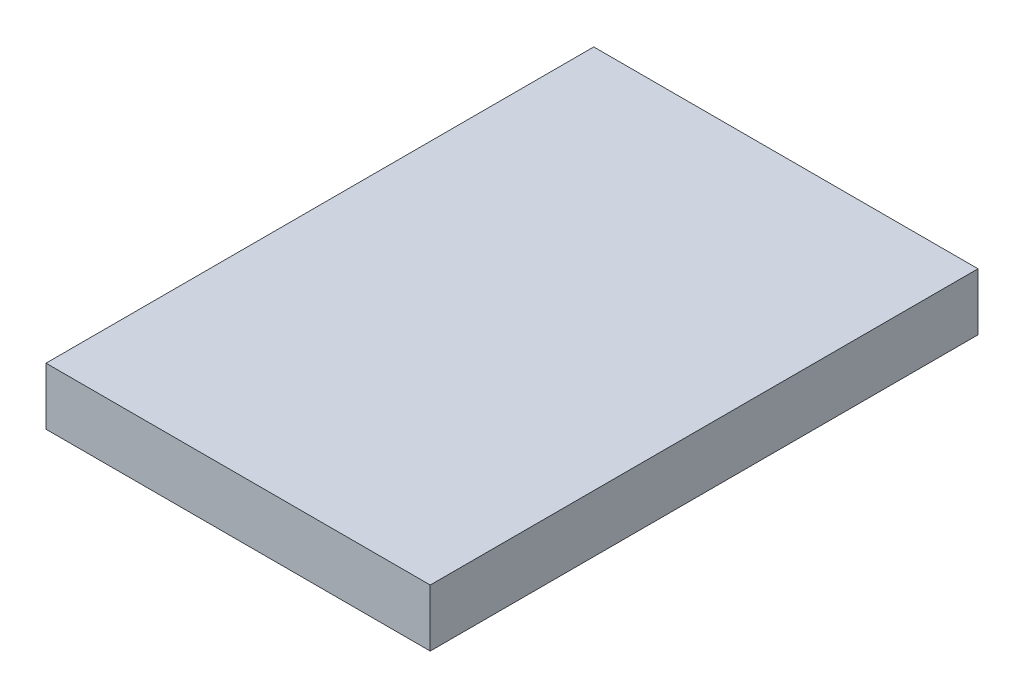
ISO-10303-21;
HEADER;
FILE_DESCRIPTION(('STEP AP214'),'2;1');
FILE_NAME('part.step','',(''),(''),'','','');
FILE_SCHEMA(('AUTOMOTIVE_DESIGN { 1 0 10303 214 1 1 1 1 }'));
ENDSEC;
DATA;
#1=APPLICATION_CONTEXT('core data for automotive mechanical design processes');
#2=APPLICATION_PROTOCOL_DEFINITION('international standard','automotive_design',2000,#1);
#3=PRODUCT_CONTEXT('',#1,'mechanical');
#4=PRODUCT('Part','Part','',(#3));
#5=PRODUCT_RELATED_PRODUCT_CATEGORY('part','',(#4));
#6=PRODUCT_DEFINITION_FORMATION('','',#4);
#7=PRODUCT_DEFINITION_CONTEXT('part definition',#1,'design');
#8=PRODUCT_DEFINITION('design','',#6,#7);
#9=PRODUCT_DEFINITION_SHAPE('','',#8);
#10=(LENGTH_UNIT() NAMED_UNIT(*) SI_UNIT(.MILLI.,.METRE.));
#11=(NAMED_UNIT(*) PLANE_ANGLE_UNIT() SI_UNIT($,.RADIAN.));
#12=(NAMED_UNIT(*) SI_UNIT($,.STERADIAN.) SOLID_ANGLE_UNIT());
#13=UNCERTAINTY_MEASURE_WITH_UNIT(LENGTH_MEASURE(1.E-05),#10,'distance_accuracy_value','');
#14=(GEOMETRIC_REPRESENTATION_CONTEXT(3) GLOBAL_UNCERTAINTY_ASSIGNED_CONTEXT((#13)) GLOBAL_UNIT_ASSIGNED_CONTEXT((#10,
#11,#12)) REPRESENTATION_CONTEXT('',''));
#15=CARTESIAN_POINT('',(0.,0.,0.));
#16=DIRECTION('',(0.,0.,1.));
#17=DIRECTION('',(1.,0.,0.));
#18=AXIS2_PLACEMENT_3D('',#15,#16,#17);
#19=CARTESIAN_POINT('',(0.,11.1125,0.));
#20=DIRECTION('',(1.,0.,0.));
#21=DIRECTION('',(0.,0.,-1.));
#22=AXIS2_PLACEMENT_3D('',#19,#20,#21);
#23=PLANE('',#22);
#24=DIRECTION('',(0.,0.,1.));
#25=VECTOR('',#24,1.);
#26=CARTESIAN_POINT('',(0.,0.,0.));
#27=LINE('',#26,#25);
#28=CARTESIAN_POINT('',(0.,0.,-106.3625));
#29=VERTEX_POINT('',#28);
#30=CARTESIAN_POINT('',(0.,0.,0.));
#31=VERTEX_POINT('',#30);
#32=EDGE_CURVE('E105',#29,#31,#27,.T.);
#33=ORIENTED_EDGE('',*,*,#32,.T.);
#34=DIRECTION('',(0.,-1.,0.));
#35=VECTOR('',#34,1.);
#36=CARTESIAN_POINT('',(0.,11.1125,0.));
#37=LINE('',#36,#35);
#38=CARTESIAN_POINT('',(0.,11.1125,0.));
#39=VERTEX_POINT('',#38);
#40=EDGE_CURVE('E11',#39,#31,#37,.T.);
#41=ORIENTED_EDGE('',*,*,#40,.F.);
#42=DIRECTION('',(0.,0.,1.));
#43=VECTOR('',#42,1.);
#44=CARTESIAN_POINT('',(0.,11.1125,0.));
#45=LINE('',#44,#43);
#46=CARTESIAN_POINT('',(0.,11.1125,-106.3625));
#47=VERTEX_POINT('',#46);
#48=EDGE_CURVE('E89',#47,#39,#45,.T.);
#49=ORIENTED_EDGE('',*,*,#48,.F.);
#50=DIRECTION('',(0.,-1.,0.));
#51=VECTOR('',#50,1.);
#52=CARTESIAN_POINT('',(0.,11.1125,-106.3625));
#53=LINE('',#52,#51);
#54=EDGE_CURVE('E97',#47,#29,#53,.T.);
#55=ORIENTED_EDGE('',*,*,#54,.T.);
#56=EDGE_LOOP('',(#33,#41,#49,#55));
#57=FACE_BOUND('',#56,.T.);
#58=ADVANCED_FACE('F39',(#57),#23,.F.);
#59=CARTESIAN_POINT('',(0.,11.1125,0.));
#60=DIRECTION('',(0.,0.,-1.));
#61=DIRECTION('',(-1.,0.,0.));
#62=AXIS2_PLACEMENT_3D('',#59,#60,#61);
#63=PLANE('',#62);
#64=DIRECTION('',(1.,0.,0.));
#65=VECTOR('',#64,1.);
#66=CARTESIAN_POINT('',(0.,0.,0.));
#67=LINE('',#66,#65);
#68=CARTESIAN_POINT('',(74.6125,0.,0.));
#69=VERTEX_POINT('',#68);
#70=EDGE_CURVE('E92',#31,#69,#67,.T.);
#71=ORIENTED_EDGE('',*,*,#70,.T.);
#72=DIRECTION('',(0.,-1.,0.));
#73=VECTOR('',#72,1.);
#74=CARTESIAN_POINT('',(74.6125,11.1125,0.));
#75=LINE('',#74,#73);
#76=CARTESIAN_POINT('',(74.6125,11.1125,0.));
#77=VERTEX_POINT('',#76);
#78=EDGE_CURVE('E50',#77,#69,#75,.T.);
#79=ORIENTED_EDGE('',*,*,#78,.F.);
#80=DIRECTION('',(1.,0.,0.));
#81=VECTOR('',#80,1.);
#82=CARTESIAN_POINT('',(0.,11.1125,0.));
#83=LINE('',#82,#81);
#84=EDGE_CURVE('E82',#39,#77,#83,.T.);
#85=ORIENTED_EDGE('',*,*,#84,.F.);
#86=ORIENTED_EDGE('',*,*,#40,.T.);
#87=EDGE_LOOP('',(#71,#79,#85,#86));
#88=FACE_BOUND('',#87,.T.);
#89=ADVANCED_FACE('F93',(#88),#63,.F.);
#90=CARTESIAN_POINT('',(74.6125,11.1125,0.));
#91=DIRECTION('',(-1.,0.,0.));
#92=DIRECTION('',(0.,0.,1.));
#93=AXIS2_PLACEMENT_3D('',#90,#91,#92);
#94=PLANE('',#93);
#95=DIRECTION('',(0.,0.,-1.));
#96=VECTOR('',#95,1.);
#97=CARTESIAN_POINT('',(74.6125,0.,0.));
#98=LINE('',#97,#96);
#99=CARTESIAN_POINT('',(74.6125,0.,-106.3625));
#100=VERTEX_POINT('',#99);
#101=EDGE_CURVE('E72',#69,#100,#98,.T.);
#102=ORIENTED_EDGE('',*,*,#101,.T.);
#103=DIRECTION('',(0.,-1.,0.));
#104=VECTOR('',#103,1.);
#105=CARTESIAN_POINT('',(74.6125,11.1125,-106.3625));
#106=LINE('',#105,#104);
#107=CARTESIAN_POINT('',(74.6125,11.1125,-106.3625));
#108=VERTEX_POINT('',#107);
#109=EDGE_CURVE('E94',#108,#100,#106,.T.);
#110=ORIENTED_EDGE('',*,*,#109,.F.);
#111=DIRECTION('',(0.,0.,-1.));
#112=VECTOR('',#111,1.);
#113=CARTESIAN_POINT('',(74.6125,11.1125,0.));
#114=LINE('',#113,#112);
#115=EDGE_CURVE('E88',#77,#108,#114,.T.);
#116=ORIENTED_EDGE('',*,*,#115,.F.);
#117=ORIENTED_EDGE('',*,*,#78,.T.);
#118=EDGE_LOOP('',(#102,#110,#116,#117));
#119=FACE_BOUND('',#118,.T.);
#120=ADVANCED_FACE('F96',(#119),#94,.F.);
#121=CARTESIAN_POINT('',(0.,11.1125,-106.3625));
#122=DIRECTION('',(0.,0.,1.));
#123=DIRECTION('',(1.,0.,0.));
#124=AXIS2_PLACEMENT_3D('',#121,#122,#123);
#125=PLANE('',#124);
#126=DIRECTION('',(-1.,0.,0.));
#127=VECTOR('',#126,1.);
#128=CARTESIAN_POINT('',(0.,0.,-106.3625));
#129=LINE('',#128,#127);
#130=EDGE_CURVE('E76',#100,#29,#129,.T.);
#131=ORIENTED_EDGE('',*,*,#130,.T.);
#132=ORIENTED_EDGE('',*,*,#54,.F.);
#133=DIRECTION('',(-1.,0.,0.));
#134=VECTOR('',#133,1.);
#135=CARTESIAN_POINT('',(0.,11.1125,-106.3625));
#136=LINE('',#135,#134);
#137=EDGE_CURVE('E54',#108,#47,#136,.T.);
#138=ORIENTED_EDGE('',*,*,#137,.F.);
#139=ORIENTED_EDGE('',*,*,#109,.T.);
#140=EDGE_LOOP('',(#131,#132,#138,#139));
#141=FACE_BOUND('',#140,.T.);
#142=ADVANCED_FACE('F108',(#141),#125,.F.);
#143=CARTESIAN_POINT('',(0.,11.1125,0.));
#144=DIRECTION('',(0.,-1.,0.));
#145=DIRECTION('',(0.,0.,-1.));
#146=AXIS2_PLACEMENT_3D('',#143,#144,#145);
#147=PLANE('',#146);
#148=ORIENTED_EDGE('',*,*,#48,.T.);
#149=ORIENTED_EDGE('',*,*,#84,.T.);
#150=ORIENTED_EDGE('',*,*,#115,.T.);
#151=ORIENTED_EDGE('',*,*,#137,.T.);
#152=EDGE_LOOP('',(#148,#149,#150,#151));
#153=FACE_BOUND('',#152,.T.);
#154=ADVANCED_FACE('F86',(#153),#147,.F.);
#155=CARTESIAN_POINT('',(0.,0.,0.));
#156=DIRECTION('',(0.,-1.,0.));
#157=DIRECTION('',(0.,0.,-1.));
#158=AXIS2_PLACEMENT_3D('',#155,#156,#157);
#159=PLANE('',#158);
#160=ORIENTED_EDGE('',*,*,#32,.F.);
#161=ORIENTED_EDGE('',*,*,#130,.F.);
#162=ORIENTED_EDGE('',*,*,#101,.F.);
#163=ORIENTED_EDGE('',*,*,#70,.F.);
#164=EDGE_LOOP('',(#160,#161,#162,#163));
#165=FACE_BOUND('',#164,.T.);
#166=ADVANCED_FACE('F115',(#165),#159,.T.);
#167=CLOSED_SHELL('',(#58,#89,#120,#142,#154,#166));
#168=MANIFOLD_SOLID_BREP('B2',#167);
#169=ADVANCED_BREP_SHAPE_REPRESENTATION('',(#18,#168),#14);
#170=SHAPE_DEFINITION_REPRESENTATION(#9,#169);
ENDSEC;
END-ISO-10303-21;
